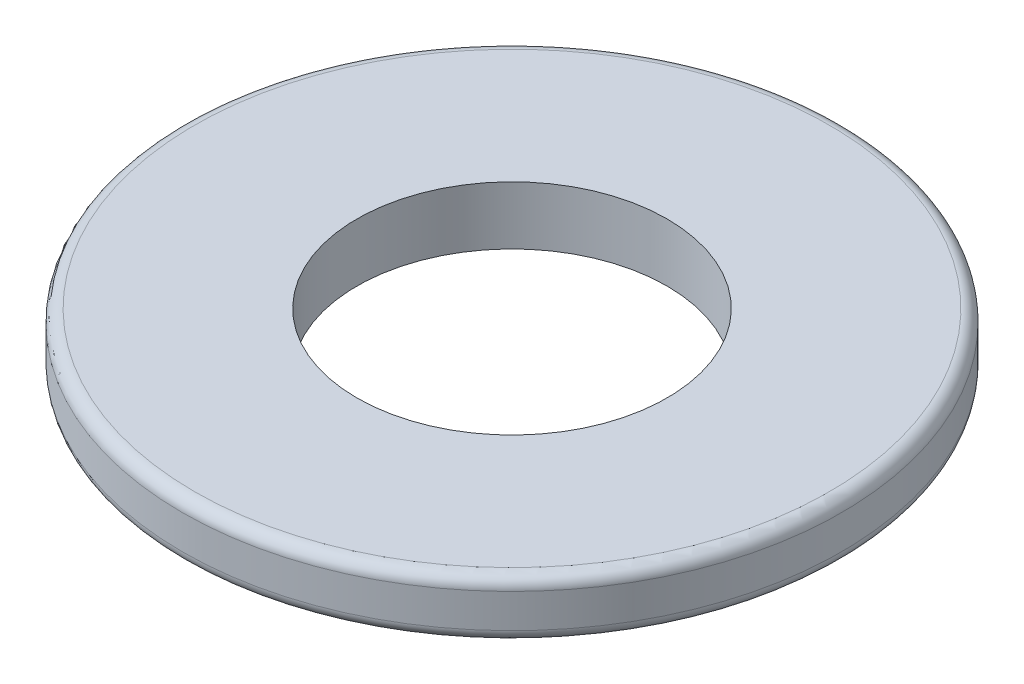
ISO-10303-21;
HEADER;
FILE_DESCRIPTION(('STEP AP214'),'2;1');
FILE_NAME('part.step','',(''),(''),'','','');
FILE_SCHEMA(('AUTOMOTIVE_DESIGN { 1 0 10303 214 1 1 1 1 }'));
ENDSEC;
DATA;
#1=APPLICATION_CONTEXT('core data for automotive mechanical design processes');
#2=APPLICATION_PROTOCOL_DEFINITION('international standard','automotive_design',2000,#1);
#3=PRODUCT_CONTEXT('',#1,'mechanical');
#4=PRODUCT('Part','Part','',(#3));
#5=PRODUCT_RELATED_PRODUCT_CATEGORY('part','',(#4));
#6=PRODUCT_DEFINITION_FORMATION('','',#4);
#7=PRODUCT_DEFINITION_CONTEXT('part definition',#1,'design');
#8=PRODUCT_DEFINITION('design','',#6,#7);
#9=PRODUCT_DEFINITION_SHAPE('','',#8);
#10=(LENGTH_UNIT() NAMED_UNIT(*) SI_UNIT(.MILLI.,.METRE.));
#11=(NAMED_UNIT(*) PLANE_ANGLE_UNIT() SI_UNIT($,.RADIAN.));
#12=(NAMED_UNIT(*) SI_UNIT($,.STERADIAN.) SOLID_ANGLE_UNIT());
#13=UNCERTAINTY_MEASURE_WITH_UNIT(LENGTH_MEASURE(1.E-05),#10,'distance_accuracy_value','');
#14=(GEOMETRIC_REPRESENTATION_CONTEXT(3) GLOBAL_UNCERTAINTY_ASSIGNED_CONTEXT((#13)) GLOBAL_UNIT_ASSIGNED_CONTEXT((#10,
#11,#12)) REPRESENTATION_CONTEXT('',''));
#15=CARTESIAN_POINT('',(0.,0.,0.));
#16=DIRECTION('',(0.,0.,1.));
#17=DIRECTION('',(1.,0.,0.));
#18=AXIS2_PLACEMENT_3D('',#15,#16,#17);
#19=CARTESIAN_POINT('',(0.,0.6,0.));
#20=DIRECTION('',(0.,1.,0.));
#21=DIRECTION('',(0.,0.,1.));
#22=AXIS2_PLACEMENT_3D('',#19,#20,#21);
#23=PLANE('',#22);
#24=CARTESIAN_POINT('',(0.,0.6,0.));
#25=DIRECTION('',(0.,1.,0.));
#26=DIRECTION('',(0.,0.,1.));
#27=AXIS2_PLACEMENT_3D('',#24,#25,#26);
#28=CIRCLE('',#27,3.275);
#29=CARTESIAN_POINT('',(0.,0.6,3.275));
#30=VERTEX_POINT('',#29);
#31=EDGE_CURVE('E10',#30,#30,#28,.T.);
#32=ORIENTED_EDGE('',*,*,#31,.T.);
#33=EDGE_LOOP('',(#32));
#34=FACE_BOUND('',#33,.T.);
#35=CARTESIAN_POINT('',(0.,0.6,0.));
#36=DIRECTION('',(0.,1.,0.));
#37=DIRECTION('',(0.,0.,1.));
#38=AXIS2_PLACEMENT_3D('',#35,#36,#37);
#39=CIRCLE('',#38,1.6);
#40=CARTESIAN_POINT('',(0.,0.6,1.6));
#41=VERTEX_POINT('',#40);
#42=EDGE_CURVE('E51',#41,#41,#39,.T.);
#43=ORIENTED_EDGE('',*,*,#42,.F.);
#44=EDGE_LOOP('',(#43));
#45=FACE_BOUND('',#44,.T.);
#46=ADVANCED_FACE('F31',(#34,#45),#23,.T.);
#47=CARTESIAN_POINT('',(0.,0.,0.));
#48=DIRECTION('',(0.,1.,0.));
#49=DIRECTION('',(0.,0.,1.));
#50=AXIS2_PLACEMENT_3D('',#47,#48,#49);
#51=PLANE('',#50);
#52=CARTESIAN_POINT('',(0.,0.,0.));
#53=DIRECTION('',(0.,1.,0.));
#54=DIRECTION('',(0.,0.,1.));
#55=AXIS2_PLACEMENT_3D('',#52,#53,#54);
#56=CIRCLE('',#55,3.275);
#57=CARTESIAN_POINT('',(0.,0.,3.275));
#58=VERTEX_POINT('',#57);
#59=EDGE_CURVE('E38',#58,#58,#56,.F.);
#60=ORIENTED_EDGE('',*,*,#59,.T.);
#61=EDGE_LOOP('',(#60));
#62=FACE_BOUND('',#61,.T.);
#63=CARTESIAN_POINT('',(0.,0.,0.));
#64=DIRECTION('',(0.,1.,0.));
#65=DIRECTION('',(0.,0.,1.));
#66=AXIS2_PLACEMENT_3D('',#63,#64,#65);
#67=CIRCLE('',#66,1.6);
#68=CARTESIAN_POINT('',(0.,0.,1.6));
#69=VERTEX_POINT('',#68);
#70=EDGE_CURVE('E52',#69,#69,#67,.T.);
#71=ORIENTED_EDGE('',*,*,#70,.T.);
#72=EDGE_LOOP('',(#71));
#73=FACE_BOUND('',#72,.T.);
#74=ADVANCED_FACE('F62',(#62,#73),#51,.F.);
#75=CARTESIAN_POINT('',(0.,0.6,0.));
#76=DIRECTION('',(0.,-1.,0.));
#77=DIRECTION('',(0.,0.,-1.));
#78=AXIS2_PLACEMENT_3D('',#75,#76,#77);
#79=CYLINDRICAL_SURFACE('',#78,3.4);
#80=CARTESIAN_POINT('',(0.,0.125,0.));
#81=DIRECTION('',(0.,1.,0.));
#82=DIRECTION('',(0.,0.,1.));
#83=AXIS2_PLACEMENT_3D('',#80,#81,#82);
#84=CIRCLE('',#83,3.4);
#85=CARTESIAN_POINT('',(0.,0.125,3.4));
#86=VERTEX_POINT('',#85);
#87=EDGE_CURVE('E42',#86,#86,#84,.T.);
#88=ORIENTED_EDGE('',*,*,#87,.T.);
#89=EDGE_LOOP('',(#88));
#90=FACE_BOUND('',#89,.T.);
#91=CARTESIAN_POINT('',(0.,0.475,0.));
#92=DIRECTION('',(0.,1.,0.));
#93=DIRECTION('',(0.,0.,1.));
#94=AXIS2_PLACEMENT_3D('',#91,#92,#93);
#95=CIRCLE('',#94,3.4);
#96=CARTESIAN_POINT('',(0.,0.475,3.4));
#97=VERTEX_POINT('',#96);
#98=EDGE_CURVE('E46',#97,#97,#95,.F.);
#99=ORIENTED_EDGE('',*,*,#98,.T.);
#100=EDGE_LOOP('',(#99));
#101=FACE_BOUND('',#100,.T.);
#102=ADVANCED_FACE('F67',(#90,#101),#79,.T.);
#103=CARTESIAN_POINT('',(0.,0.6,0.));
#104=DIRECTION('',(0.,-1.,0.));
#105=DIRECTION('',(0.,0.,-1.));
#106=AXIS2_PLACEMENT_3D('',#103,#104,#105);
#107=CYLINDRICAL_SURFACE('',#106,1.6);
#108=ORIENTED_EDGE('',*,*,#42,.T.);
#109=EDGE_LOOP('',(#108));
#110=FACE_BOUND('',#109,.T.);
#111=ORIENTED_EDGE('',*,*,#70,.F.);
#112=EDGE_LOOP('',(#111));
#113=FACE_BOUND('',#112,.T.);
#114=ADVANCED_FACE('F58',(#110,#113),#107,.F.);
#115=CARTESIAN_POINT('',(0.,0.125,0.));
#116=DIRECTION('',(0.,1.,0.));
#117=DIRECTION('',(0.,0.,1.));
#118=AXIS2_PLACEMENT_3D('',#115,#116,#117);
#119=TOROIDAL_SURFACE('',#118,3.275,0.125);
#120=ORIENTED_EDGE('',*,*,#59,.F.);
#121=EDGE_LOOP('',(#120));
#122=FACE_BOUND('',#121,.T.);
#123=ORIENTED_EDGE('',*,*,#87,.F.);
#124=EDGE_LOOP('',(#123));
#125=FACE_BOUND('',#124,.T.);
#126=ADVANCED_FACE('F73',(#122,#125),#119,.T.);
#127=CARTESIAN_POINT('',(0.,0.475,0.));
#128=DIRECTION('',(0.,1.,0.));
#129=DIRECTION('',(0.,0.,1.));
#130=AXIS2_PLACEMENT_3D('',#127,#128,#129);
#131=TOROIDAL_SURFACE('',#130,3.275,0.125);
#132=ORIENTED_EDGE('',*,*,#98,.F.);
#133=EDGE_LOOP('',(#132));
#134=FACE_BOUND('',#133,.T.);
#135=ORIENTED_EDGE('',*,*,#31,.F.);
#136=EDGE_LOOP('',(#135));
#137=FACE_BOUND('',#136,.T.);
#138=ADVANCED_FACE('F33',(#134,#137),#131,.T.);
#139=CLOSED_SHELL('',(#46,#74,#102,#114,#126,#138));
#140=MANIFOLD_SOLID_BREP('B2',#139);
#141=ADVANCED_BREP_SHAPE_REPRESENTATION('',(#18,#140),#14);
#142=SHAPE_DEFINITION_REPRESENTATION(#9,#141);
ENDSEC;
END-ISO-10303-21;
